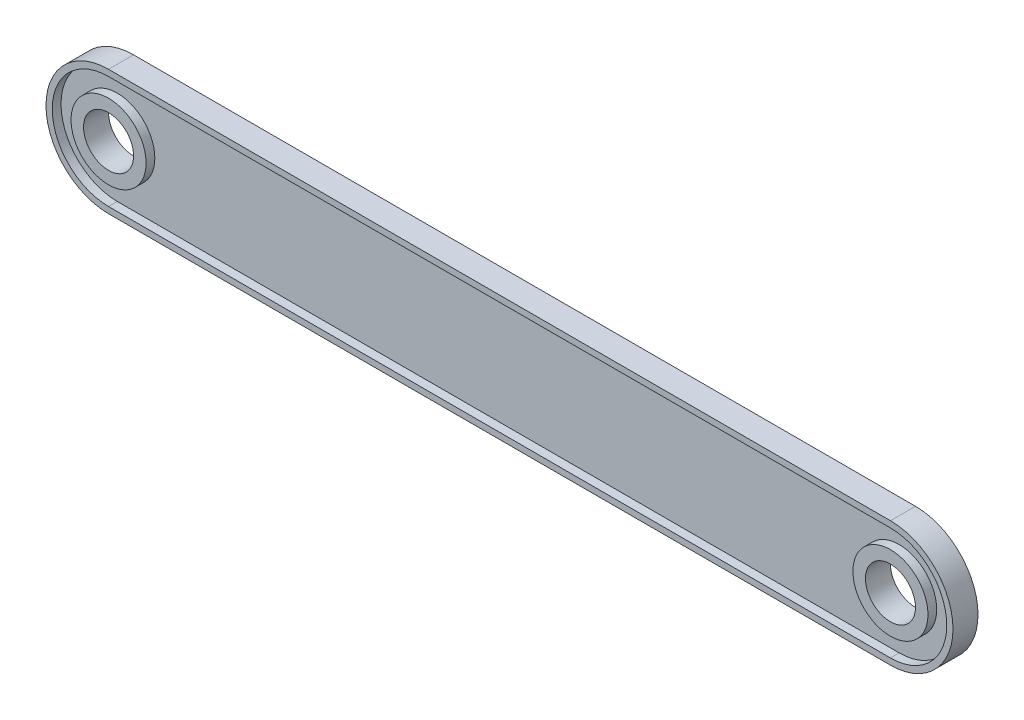
ISO-10303-21;
HEADER;
FILE_DESCRIPTION(('STEP AP214'),'2;1');
FILE_NAME('part.step','',(''),(''),'','','');
FILE_SCHEMA(('AUTOMOTIVE_DESIGN { 1 0 10303 214 1 1 1 1 }'));
ENDSEC;
DATA;
#1=APPLICATION_CONTEXT('core data for automotive mechanical design processes');
#2=APPLICATION_PROTOCOL_DEFINITION('international standard','automotive_design',2000,#1);
#3=PRODUCT_CONTEXT('',#1,'mechanical');
#4=PRODUCT('Part','Part','',(#3));
#5=PRODUCT_RELATED_PRODUCT_CATEGORY('part','',(#4));
#6=PRODUCT_DEFINITION_FORMATION('','',#4);
#7=PRODUCT_DEFINITION_CONTEXT('part definition',#1,'design');
#8=PRODUCT_DEFINITION('design','',#6,#7);
#9=PRODUCT_DEFINITION_SHAPE('','',#8);
#10=(LENGTH_UNIT() NAMED_UNIT(*) SI_UNIT(.MILLI.,.METRE.));
#11=(NAMED_UNIT(*) PLANE_ANGLE_UNIT() SI_UNIT($,.RADIAN.));
#12=(NAMED_UNIT(*) SI_UNIT($,.STERADIAN.) SOLID_ANGLE_UNIT());
#13=UNCERTAINTY_MEASURE_WITH_UNIT(LENGTH_MEASURE(1.E-05),#10,'distance_accuracy_value','');
#14=(GEOMETRIC_REPRESENTATION_CONTEXT(3) GLOBAL_UNCERTAINTY_ASSIGNED_CONTEXT((#13)) GLOBAL_UNIT_ASSIGNED_CONTEXT((#10,
#11,#12)) REPRESENTATION_CONTEXT('',''));
#15=CARTESIAN_POINT('',(0.,0.,0.));
#16=DIRECTION('',(0.,0.,1.));
#17=DIRECTION('',(1.,0.,0.));
#18=AXIS2_PLACEMENT_3D('',#15,#16,#17);
#19=CARTESIAN_POINT('',(0.,0.,3.));
#20=DIRECTION('',(0.,0.,1.));
#21=DIRECTION('',(1.,0.,0.));
#22=AXIS2_PLACEMENT_3D('',#19,#20,#21);
#23=PLANE('',#22);
#24=CARTESIAN_POINT('',(625.,0.,3.));
#25=DIRECTION('',(0.,0.,1.));
#26=DIRECTION('',(1.,0.,0.));
#27=AXIS2_PLACEMENT_3D('',#24,#25,#26);
#28=CIRCLE('',#27,30.);
#29=CARTESIAN_POINT('',(655.,0.,3.));
#30=VERTEX_POINT('',#29);
#31=EDGE_CURVE('E151',#30,#30,#28,.T.);
#32=ORIENTED_EDGE('',*,*,#31,.F.);
#33=EDGE_LOOP('',(#32));
#34=FACE_BOUND('',#33,.T.);
#35=CARTESIAN_POINT('',(0.,0.,3.));
#36=DIRECTION('',(0.,0.,1.));
#37=DIRECTION('',(1.,0.,0.));
#38=AXIS2_PLACEMENT_3D('',#35,#36,#37);
#39=CIRCLE('',#38,30.);
#40=CARTESIAN_POINT('',(30.,0.,3.));
#41=VERTEX_POINT('',#40);
#42=EDGE_CURVE('E154',#41,#41,#39,.T.);
#43=ORIENTED_EDGE('',*,*,#42,.F.);
#44=EDGE_LOOP('',(#43));
#45=FACE_BOUND('',#44,.T.);
#46=DIRECTION('',(1.,0.,0.));
#47=VECTOR('',#46,1.);
#48=CARTESIAN_POINT('',(0.,45.,3.));
#49=LINE('',#48,#47);
#50=CARTESIAN_POINT('',(0.,45.,3.));
#51=VERTEX_POINT('',#50);
#52=CARTESIAN_POINT('',(625.,45.,3.));
#53=VERTEX_POINT('',#52);
#54=EDGE_CURVE('E157',#51,#53,#49,.T.);
#55=ORIENTED_EDGE('',*,*,#54,.F.);
#56=CARTESIAN_POINT('',(0.,0.,3.));
#57=DIRECTION('',(0.,0.,1.));
#58=DIRECTION('',(1.,0.,0.));
#59=AXIS2_PLACEMENT_3D('',#56,#57,#58);
#60=CIRCLE('',#59,45.);
#61=CARTESIAN_POINT('',(0.,-45.,3.));
#62=VERTEX_POINT('',#61);
#63=EDGE_CURVE('E160',#51,#62,#60,.T.);
#64=ORIENTED_EDGE('',*,*,#63,.T.);
#65=DIRECTION('',(1.,0.,0.));
#66=VECTOR('',#65,1.);
#67=CARTESIAN_POINT('',(0.,-45.,3.));
#68=LINE('',#67,#66);
#69=CARTESIAN_POINT('',(625.,-45.,3.));
#70=VERTEX_POINT('',#69);
#71=EDGE_CURVE('E82',#62,#70,#68,.T.);
#72=ORIENTED_EDGE('',*,*,#71,.T.);
#73=CARTESIAN_POINT('',(625.,0.,3.));
#74=DIRECTION('',(0.,0.,1.));
#75=DIRECTION('',(1.,0.,0.));
#76=AXIS2_PLACEMENT_3D('',#73,#74,#75);
#77=CIRCLE('',#76,45.);
#78=EDGE_CURVE('E12',#70,#53,#77,.T.);
#79=ORIENTED_EDGE('',*,*,#78,.T.);
#80=EDGE_LOOP('',(#55,#64,#72,#79));
#81=FACE_BOUND('',#80,.T.);
#82=ADVANCED_FACE('F72',(#34,#45,#81),#23,.T.);
#83=CARTESIAN_POINT('',(0.,0.,-3.));
#84=DIRECTION('',(0.,0.,1.));
#85=DIRECTION('',(1.,0.,0.));
#86=AXIS2_PLACEMENT_3D('',#83,#84,#85);
#87=PLANE('',#86);
#88=CARTESIAN_POINT('',(625.,0.,-3.));
#89=DIRECTION('',(0.,0.,1.));
#90=DIRECTION('',(1.,0.,0.));
#91=AXIS2_PLACEMENT_3D('',#88,#89,#90);
#92=CIRCLE('',#91,30.);
#93=CARTESIAN_POINT('',(655.,0.,-3.));
#94=VERTEX_POINT('',#93);
#95=EDGE_CURVE('E233',#94,#94,#92,.F.);
#96=ORIENTED_EDGE('',*,*,#95,.F.);
#97=EDGE_LOOP('',(#96));
#98=FACE_BOUND('',#97,.T.);
#99=CARTESIAN_POINT('',(0.,0.,-3.));
#100=DIRECTION('',(0.,0.,1.));
#101=DIRECTION('',(1.,0.,0.));
#102=AXIS2_PLACEMENT_3D('',#99,#100,#101);
#103=CIRCLE('',#102,30.);
#104=CARTESIAN_POINT('',(30.,0.,-3.));
#105=VERTEX_POINT('',#104);
#106=EDGE_CURVE('E204',#105,#105,#103,.F.);
#107=ORIENTED_EDGE('',*,*,#106,.F.);
#108=EDGE_LOOP('',(#107));
#109=FACE_BOUND('',#108,.T.);
#110=DIRECTION('',(1.,0.,0.));
#111=VECTOR('',#110,1.);
#112=CARTESIAN_POINT('',(0.,45.,-3.));
#113=LINE('',#112,#111);
#114=CARTESIAN_POINT('',(0.,45.,-3.));
#115=VERTEX_POINT('',#114);
#116=CARTESIAN_POINT('',(625.,45.,-3.));
#117=VERTEX_POINT('',#116);
#118=EDGE_CURVE('E124',#115,#117,#113,.T.);
#119=ORIENTED_EDGE('',*,*,#118,.T.);
#120=CARTESIAN_POINT('',(625.,0.,-3.));
#121=DIRECTION('',(0.,0.,1.));
#122=DIRECTION('',(1.,0.,0.));
#123=AXIS2_PLACEMENT_3D('',#120,#121,#122);
#124=CIRCLE('',#123,45.);
#125=CARTESIAN_POINT('',(625.,-45.,-3.));
#126=VERTEX_POINT('',#125);
#127=EDGE_CURVE('E76',#126,#117,#124,.T.);
#128=ORIENTED_EDGE('',*,*,#127,.F.);
#129=DIRECTION('',(1.,0.,0.));
#130=VECTOR('',#129,1.);
#131=CARTESIAN_POINT('',(0.,-45.,-3.));
#132=LINE('',#131,#130);
#133=CARTESIAN_POINT('',(0.,-45.,-3.));
#134=VERTEX_POINT('',#133);
#135=EDGE_CURVE('E104',#134,#126,#132,.T.);
#136=ORIENTED_EDGE('',*,*,#135,.F.);
#137=CARTESIAN_POINT('',(0.,0.,-3.));
#138=DIRECTION('',(0.,0.,1.));
#139=DIRECTION('',(1.,0.,0.));
#140=AXIS2_PLACEMENT_3D('',#137,#138,#139);
#141=CIRCLE('',#140,45.);
#142=EDGE_CURVE('E106',#115,#134,#141,.T.);
#143=ORIENTED_EDGE('',*,*,#142,.F.);
#144=EDGE_LOOP('',(#119,#128,#136,#143));
#145=FACE_BOUND('',#144,.T.);
#146=ADVANCED_FACE('F74',(#98,#109,#145),#87,.F.);
#147=CARTESIAN_POINT('',(0.,0.,10.));
#148=DIRECTION('',(0.,0.,-1.));
#149=DIRECTION('',(-1.,0.,0.));
#150=AXIS2_PLACEMENT_3D('',#147,#148,#149);
#151=CYLINDRICAL_SURFACE('',#150,45.);
#152=ORIENTED_EDGE('',*,*,#142,.T.);
#153=DIRECTION('',(0.,0.,-1.));
#154=VECTOR('',#153,1.);
#155=CARTESIAN_POINT('',(0.,-45.,10.));
#156=LINE('',#155,#154);
#157=CARTESIAN_POINT('',(0.,-45.,-10.));
#158=VERTEX_POINT('',#157);
#159=EDGE_CURVE('E120',#134,#158,#156,.T.);
#160=ORIENTED_EDGE('',*,*,#159,.T.);
#161=CARTESIAN_POINT('',(0.,0.,-10.));
#162=DIRECTION('',(0.,0.,1.));
#163=DIRECTION('',(1.,0.,0.));
#164=AXIS2_PLACEMENT_3D('',#161,#162,#163);
#165=CIRCLE('',#164,45.);
#166=CARTESIAN_POINT('',(0.,45.,-10.));
#167=VERTEX_POINT('',#166);
#168=EDGE_CURVE('E203',#167,#158,#165,.T.);
#169=ORIENTED_EDGE('',*,*,#168,.F.);
#170=DIRECTION('',(0.,0.,-1.));
#171=VECTOR('',#170,1.);
#172=CARTESIAN_POINT('',(0.,45.,10.));
#173=LINE('',#172,#171);
#174=EDGE_CURVE('E123',#115,#167,#173,.T.);
#175=ORIENTED_EDGE('',*,*,#174,.F.);
#176=EDGE_LOOP('',(#152,#160,#169,#175));
#177=FACE_BOUND('',#176,.T.);
#178=ADVANCED_FACE('F117',(#177),#151,.F.);
#179=CARTESIAN_POINT('',(0.,45.,10.));
#180=DIRECTION('',(0.,1.,0.));
#181=DIRECTION('',(0.,0.,1.));
#182=AXIS2_PLACEMENT_3D('',#179,#180,#181);
#183=PLANE('',#182);
#184=DIRECTION('',(0.,0.,-1.));
#185=VECTOR('',#184,1.);
#186=CARTESIAN_POINT('',(625.,45.,10.));
#187=LINE('',#186,#185);
#188=CARTESIAN_POINT('',(625.,45.,-10.));
#189=VERTEX_POINT('',#188);
#190=EDGE_CURVE('E143',#117,#189,#187,.T.);
#191=ORIENTED_EDGE('',*,*,#190,.F.);
#192=ORIENTED_EDGE('',*,*,#118,.F.);
#193=ORIENTED_EDGE('',*,*,#174,.T.);
#194=DIRECTION('',(1.,0.,0.));
#195=VECTOR('',#194,1.);
#196=CARTESIAN_POINT('',(0.,45.,-10.));
#197=LINE('',#196,#195);
#198=EDGE_CURVE('E200',#167,#189,#197,.T.);
#199=ORIENTED_EDGE('',*,*,#198,.T.);
#200=EDGE_LOOP('',(#191,#192,#193,#199));
#201=FACE_BOUND('',#200,.T.);
#202=ADVANCED_FACE('F295',(#201),#183,.F.);
#203=CARTESIAN_POINT('',(625.,0.,10.));
#204=DIRECTION('',(0.,0.,-1.));
#205=DIRECTION('',(-1.,0.,0.));
#206=AXIS2_PLACEMENT_3D('',#203,#204,#205);
#207=CYLINDRICAL_SURFACE('',#206,45.);
#208=ORIENTED_EDGE('',*,*,#127,.T.);
#209=ORIENTED_EDGE('',*,*,#190,.T.);
#210=CARTESIAN_POINT('',(625.,0.,-10.));
#211=DIRECTION('',(0.,0.,1.));
#212=DIRECTION('',(1.,0.,0.));
#213=AXIS2_PLACEMENT_3D('',#210,#211,#212);
#214=CIRCLE('',#213,45.);
#215=CARTESIAN_POINT('',(625.,-45.,-10.));
#216=VERTEX_POINT('',#215);
#217=EDGE_CURVE('E197',#216,#189,#214,.T.);
#218=ORIENTED_EDGE('',*,*,#217,.F.);
#219=DIRECTION('',(0.,0.,-1.));
#220=VECTOR('',#219,1.);
#221=CARTESIAN_POINT('',(625.,-45.,10.));
#222=LINE('',#221,#220);
#223=EDGE_CURVE('E134',#126,#216,#222,.T.);
#224=ORIENTED_EDGE('',*,*,#223,.F.);
#225=EDGE_LOOP('',(#208,#209,#218,#224));
#226=FACE_BOUND('',#225,.T.);
#227=ADVANCED_FACE('F300',(#226),#207,.F.);
#228=CARTESIAN_POINT('',(0.,-45.,10.));
#229=DIRECTION('',(0.,1.,0.));
#230=DIRECTION('',(0.,0.,1.));
#231=AXIS2_PLACEMENT_3D('',#228,#229,#230);
#232=PLANE('',#231);
#233=ORIENTED_EDGE('',*,*,#135,.T.);
#234=ORIENTED_EDGE('',*,*,#223,.T.);
#235=DIRECTION('',(1.,0.,0.));
#236=VECTOR('',#235,1.);
#237=CARTESIAN_POINT('',(0.,-45.,-10.));
#238=LINE('',#237,#236);
#239=EDGE_CURVE('E129',#158,#216,#238,.T.);
#240=ORIENTED_EDGE('',*,*,#239,.F.);
#241=ORIENTED_EDGE('',*,*,#159,.F.);
#242=EDGE_LOOP('',(#233,#234,#240,#241));
#243=FACE_BOUND('',#242,.T.);
#244=ADVANCED_FACE('F127',(#243),#232,.T.);
#245=CARTESIAN_POINT('',(0.,-50.,10.));
#246=DIRECTION('',(0.,1.,0.));
#247=DIRECTION('',(0.,0.,1.));
#248=AXIS2_PLACEMENT_3D('',#245,#246,#247);
#249=PLANE('',#248);
#250=DIRECTION('',(1.,0.,0.));
#251=VECTOR('',#250,1.);
#252=CARTESIAN_POINT('',(0.,-50.,-10.));
#253=LINE('',#252,#251);
#254=CARTESIAN_POINT('',(0.,-50.,-10.));
#255=VERTEX_POINT('',#254);
#256=CARTESIAN_POINT('',(625.,-50.,-10.));
#257=VERTEX_POINT('',#256);
#258=EDGE_CURVE('E194',#255,#257,#253,.T.);
#259=ORIENTED_EDGE('',*,*,#258,.T.);
#260=DIRECTION('',(0.,0.,-1.));
#261=VECTOR('',#260,1.);
#262=CARTESIAN_POINT('',(625.,-50.,10.));
#263=LINE('',#262,#261);
#264=CARTESIAN_POINT('',(625.,-50.,10.));
#265=VERTEX_POINT('',#264);
#266=EDGE_CURVE('E140',#265,#257,#263,.T.);
#267=ORIENTED_EDGE('',*,*,#266,.F.);
#268=DIRECTION('',(1.,0.,0.));
#269=VECTOR('',#268,1.);
#270=CARTESIAN_POINT('',(0.,-50.,10.));
#271=LINE('',#270,#269);
#272=CARTESIAN_POINT('',(0.,-50.,10.));
#273=VERTEX_POINT('',#272);
#274=EDGE_CURVE('E210',#273,#265,#271,.T.);
#275=ORIENTED_EDGE('',*,*,#274,.F.);
#276=DIRECTION('',(0.,0.,-1.));
#277=VECTOR('',#276,1.);
#278=CARTESIAN_POINT('',(0.,-50.,10.));
#279=LINE('',#278,#277);
#280=EDGE_CURVE('E150',#273,#255,#279,.T.);
#281=ORIENTED_EDGE('',*,*,#280,.T.);
#282=EDGE_LOOP('',(#259,#267,#275,#281));
#283=FACE_BOUND('',#282,.T.);
#284=ADVANCED_FACE('F304',(#283),#249,.F.);
#285=CARTESIAN_POINT('',(625.,0.,10.));
#286=DIRECTION('',(0.,0.,-1.));
#287=DIRECTION('',(-1.,0.,0.));
#288=AXIS2_PLACEMENT_3D('',#285,#286,#287);
#289=CYLINDRICAL_SURFACE('',#288,50.);
#290=CARTESIAN_POINT('',(625.,0.,-10.));
#291=DIRECTION('',(0.,0.,1.));
#292=DIRECTION('',(1.,0.,0.));
#293=AXIS2_PLACEMENT_3D('',#290,#291,#292);
#294=CIRCLE('',#293,50.);
#295=CARTESIAN_POINT('',(625.,50.,-10.));
#296=VERTEX_POINT('',#295);
#297=EDGE_CURVE('E192',#257,#296,#294,.T.);
#298=ORIENTED_EDGE('',*,*,#297,.T.);
#299=DIRECTION('',(0.,0.,-1.));
#300=VECTOR('',#299,1.);
#301=CARTESIAN_POINT('',(625.,50.,10.));
#302=LINE('',#301,#300);
#303=CARTESIAN_POINT('',(625.,50.,10.));
#304=VERTEX_POINT('',#303);
#305=EDGE_CURVE('E166',#304,#296,#302,.T.);
#306=ORIENTED_EDGE('',*,*,#305,.F.);
#307=CARTESIAN_POINT('',(625.,0.,10.));
#308=DIRECTION('',(0.,0.,1.));
#309=DIRECTION('',(1.,0.,0.));
#310=AXIS2_PLACEMENT_3D('',#307,#308,#309);
#311=CIRCLE('',#310,50.);
#312=EDGE_CURVE('E207',#265,#304,#311,.T.);
#313=ORIENTED_EDGE('',*,*,#312,.F.);
#314=ORIENTED_EDGE('',*,*,#266,.T.);
#315=EDGE_LOOP('',(#298,#306,#313,#314));
#316=FACE_BOUND('',#315,.T.);
#317=ADVANCED_FACE('F307',(#316),#289,.T.);
#318=CARTESIAN_POINT('',(0.,50.,10.));
#319=DIRECTION('',(0.,1.,0.));
#320=DIRECTION('',(0.,0.,1.));
#321=AXIS2_PLACEMENT_3D('',#318,#319,#320);
#322=PLANE('',#321);
#323=DIRECTION('',(1.,0.,0.));
#324=VECTOR('',#323,1.);
#325=CARTESIAN_POINT('',(0.,50.,-10.));
#326=LINE('',#325,#324);
#327=CARTESIAN_POINT('',(0.,50.,-10.));
#328=VERTEX_POINT('',#327);
#329=EDGE_CURVE('E189',#328,#296,#326,.T.);
#330=ORIENTED_EDGE('',*,*,#329,.F.);
#331=DIRECTION('',(0.,0.,-1.));
#332=VECTOR('',#331,1.);
#333=CARTESIAN_POINT('',(0.,50.,10.));
#334=LINE('',#333,#332);
#335=CARTESIAN_POINT('',(0.,50.,10.));
#336=VERTEX_POINT('',#335);
#337=EDGE_CURVE('E174',#336,#328,#334,.T.);
#338=ORIENTED_EDGE('',*,*,#337,.F.);
#339=DIRECTION('',(1.,0.,0.));
#340=VECTOR('',#339,1.);
#341=CARTESIAN_POINT('',(0.,50.,10.));
#342=LINE('',#341,#340);
#343=EDGE_CURVE('E136',#336,#304,#342,.T.);
#344=ORIENTED_EDGE('',*,*,#343,.T.);
#345=ORIENTED_EDGE('',*,*,#305,.T.);
#346=EDGE_LOOP('',(#330,#338,#344,#345));
#347=FACE_BOUND('',#346,.T.);
#348=ADVANCED_FACE('F289',(#347),#322,.T.);
#349=CARTESIAN_POINT('',(0.,-45.,10.));
#350=VERTEX_POINT('',#349);
#351=EDGE_CURVE('E130',#350,#62,#156,.T.);
#352=ORIENTED_EDGE('',*,*,#351,.T.);
#353=ORIENTED_EDGE('',*,*,#63,.F.);
#354=CARTESIAN_POINT('',(0.,45.,10.));
#355=VERTEX_POINT('',#354);
#356=EDGE_CURVE('E147',#355,#51,#173,.T.);
#357=ORIENTED_EDGE('',*,*,#356,.F.);
#358=CARTESIAN_POINT('',(0.,0.,10.));
#359=DIRECTION('',(0.,0.,1.));
#360=DIRECTION('',(1.,0.,0.));
#361=AXIS2_PLACEMENT_3D('',#358,#359,#360);
#362=CIRCLE('',#361,45.);
#363=EDGE_CURVE('E188',#355,#350,#362,.T.);
#364=ORIENTED_EDGE('',*,*,#363,.T.);
#365=EDGE_LOOP('',(#352,#353,#357,#364));
#366=FACE_BOUND('',#365,.T.);
#367=ADVANCED_FACE('F285',(#366),#151,.F.);
#368=ORIENTED_EDGE('',*,*,#54,.T.);
#369=CARTESIAN_POINT('',(625.,45.,10.));
#370=VERTEX_POINT('',#369);
#371=EDGE_CURVE('E144',#370,#53,#187,.T.);
#372=ORIENTED_EDGE('',*,*,#371,.F.);
#373=DIRECTION('',(1.,0.,0.));
#374=VECTOR('',#373,1.);
#375=CARTESIAN_POINT('',(0.,45.,10.));
#376=LINE('',#375,#374);
#377=EDGE_CURVE('E218',#355,#370,#376,.T.);
#378=ORIENTED_EDGE('',*,*,#377,.F.);
#379=ORIENTED_EDGE('',*,*,#356,.T.);
#380=EDGE_LOOP('',(#368,#372,#378,#379));
#381=FACE_BOUND('',#380,.T.);
#382=ADVANCED_FACE('F288',(#381),#183,.F.);
#383=ORIENTED_EDGE('',*,*,#371,.T.);
#384=ORIENTED_EDGE('',*,*,#78,.F.);
#385=CARTESIAN_POINT('',(625.,-45.,10.));
#386=VERTEX_POINT('',#385);
#387=EDGE_CURVE('E90',#386,#70,#222,.T.);
#388=ORIENTED_EDGE('',*,*,#387,.F.);
#389=CARTESIAN_POINT('',(625.,0.,10.));
#390=DIRECTION('',(0.,0.,1.));
#391=DIRECTION('',(1.,0.,0.));
#392=AXIS2_PLACEMENT_3D('',#389,#390,#391);
#393=CIRCLE('',#392,45.);
#394=EDGE_CURVE('E215',#386,#370,#393,.T.);
#395=ORIENTED_EDGE('',*,*,#394,.T.);
#396=EDGE_LOOP('',(#383,#384,#388,#395));
#397=FACE_BOUND('',#396,.T.);
#398=ADVANCED_FACE('F293',(#397),#207,.F.);
#399=ORIENTED_EDGE('',*,*,#387,.T.);
#400=ORIENTED_EDGE('',*,*,#71,.F.);
#401=ORIENTED_EDGE('',*,*,#351,.F.);
#402=DIRECTION('',(1.,0.,0.));
#403=VECTOR('',#402,1.);
#404=CARTESIAN_POINT('',(0.,-45.,10.));
#405=LINE('',#404,#403);
#406=EDGE_CURVE('E213',#350,#386,#405,.T.);
#407=ORIENTED_EDGE('',*,*,#406,.T.);
#408=EDGE_LOOP('',(#399,#400,#401,#407));
#409=FACE_BOUND('',#408,.T.);
#410=ADVANCED_FACE('F298',(#409),#232,.T.);
#411=CARTESIAN_POINT('',(0.,0.,10.));
#412=DIRECTION('',(0.,0.,-1.));
#413=DIRECTION('',(-1.,0.,0.));
#414=AXIS2_PLACEMENT_3D('',#411,#412,#413);
#415=CYLINDRICAL_SURFACE('',#414,50.);
#416=CARTESIAN_POINT('',(0.,0.,-10.));
#417=DIRECTION('',(0.,0.,1.));
#418=DIRECTION('',(1.,0.,0.));
#419=AXIS2_PLACEMENT_3D('',#416,#417,#418);
#420=CIRCLE('',#419,50.);
#421=EDGE_CURVE('E185',#328,#255,#420,.T.);
#422=ORIENTED_EDGE('',*,*,#421,.T.);
#423=ORIENTED_EDGE('',*,*,#280,.F.);
#424=CARTESIAN_POINT('',(0.,0.,10.));
#425=DIRECTION('',(0.,0.,1.));
#426=DIRECTION('',(1.,0.,0.));
#427=AXIS2_PLACEMENT_3D('',#424,#425,#426);
#428=CIRCLE('',#427,50.);
#429=EDGE_CURVE('E131',#336,#273,#428,.T.);
#430=ORIENTED_EDGE('',*,*,#429,.F.);
#431=ORIENTED_EDGE('',*,*,#337,.T.);
#432=EDGE_LOOP('',(#422,#423,#430,#431));
#433=FACE_BOUND('',#432,.T.);
#434=ADVANCED_FACE('F303',(#433),#415,.T.);
#435=CARTESIAN_POINT('',(0.,0.,10.));
#436=DIRECTION('',(0.,0.,1.));
#437=DIRECTION('',(1.,0.,0.));
#438=AXIS2_PLACEMENT_3D('',#435,#436,#437);
#439=PLANE('',#438);
#440=ORIENTED_EDGE('',*,*,#363,.F.);
#441=ORIENTED_EDGE('',*,*,#377,.T.);
#442=ORIENTED_EDGE('',*,*,#394,.F.);
#443=ORIENTED_EDGE('',*,*,#406,.F.);
#444=EDGE_LOOP('',(#440,#441,#442,#443));
#445=FACE_BOUND('',#444,.T.);
#446=ORIENTED_EDGE('',*,*,#274,.T.);
#447=ORIENTED_EDGE('',*,*,#312,.T.);
#448=ORIENTED_EDGE('',*,*,#343,.F.);
#449=ORIENTED_EDGE('',*,*,#429,.T.);
#450=EDGE_LOOP('',(#446,#447,#448,#449));
#451=FACE_BOUND('',#450,.T.);
#452=ADVANCED_FACE('F315',(#445,#451),#439,.T.);
#453=CARTESIAN_POINT('',(0.,0.,-10.));
#454=DIRECTION('',(0.,0.,1.));
#455=DIRECTION('',(1.,0.,0.));
#456=AXIS2_PLACEMENT_3D('',#453,#454,#455);
#457=PLANE('',#456);
#458=ORIENTED_EDGE('',*,*,#168,.T.);
#459=ORIENTED_EDGE('',*,*,#239,.T.);
#460=ORIENTED_EDGE('',*,*,#217,.T.);
#461=ORIENTED_EDGE('',*,*,#198,.F.);
#462=EDGE_LOOP('',(#458,#459,#460,#461));
#463=FACE_BOUND('',#462,.T.);
#464=ORIENTED_EDGE('',*,*,#258,.F.);
#465=ORIENTED_EDGE('',*,*,#421,.F.);
#466=ORIENTED_EDGE('',*,*,#329,.T.);
#467=ORIENTED_EDGE('',*,*,#297,.F.);
#468=EDGE_LOOP('',(#464,#465,#466,#467));
#469=FACE_BOUND('',#468,.T.);
#470=ADVANCED_FACE('F317',(#463,#469),#457,.F.);
#471=CARTESIAN_POINT('',(0.,0.,10.));
#472=DIRECTION('',(0.,0.,-1.));
#473=DIRECTION('',(-1.,0.,0.));
#474=AXIS2_PLACEMENT_3D('',#471,#472,#473);
#475=CYLINDRICAL_SURFACE('',#474,30.);
#476=CARTESIAN_POINT('',(0.,0.,-10.));
#477=DIRECTION('',(0.,0.,1.));
#478=DIRECTION('',(1.,0.,0.));
#479=AXIS2_PLACEMENT_3D('',#476,#477,#478);
#480=CIRCLE('',#479,30.);
#481=CARTESIAN_POINT('',(30.,0.,-10.));
#482=VERTEX_POINT('',#481);
#483=EDGE_CURVE('E230',#482,#482,#480,.T.);
#484=ORIENTED_EDGE('',*,*,#483,.T.);
#485=EDGE_LOOP('',(#484));
#486=FACE_BOUND('',#485,.T.);
#487=ORIENTED_EDGE('',*,*,#106,.T.);
#488=EDGE_LOOP('',(#487));
#489=FACE_BOUND('',#488,.T.);
#490=ADVANCED_FACE('F320',(#486,#489),#475,.T.);
#491=ORIENTED_EDGE('',*,*,#42,.T.);
#492=EDGE_LOOP('',(#491));
#493=FACE_BOUND('',#492,.T.);
#494=CARTESIAN_POINT('',(0.,0.,10.));
#495=DIRECTION('',(0.,0.,1.));
#496=DIRECTION('',(1.,0.,0.));
#497=AXIS2_PLACEMENT_3D('',#494,#495,#496);
#498=CIRCLE('',#497,30.);
#499=CARTESIAN_POINT('',(30.,0.,10.));
#500=VERTEX_POINT('',#499);
#501=EDGE_CURVE('E229',#500,#500,#498,.T.);
#502=ORIENTED_EDGE('',*,*,#501,.F.);
#503=EDGE_LOOP('',(#502));
#504=FACE_BOUND('',#503,.T.);
#505=ADVANCED_FACE('F325',(#493,#504),#475,.T.);
#506=CARTESIAN_POINT('',(0.,0.,10.));
#507=DIRECTION('',(0.,0.,-1.));
#508=DIRECTION('',(-1.,0.,0.));
#509=AXIS2_PLACEMENT_3D('',#506,#507,#508);
#510=CYLINDRICAL_SURFACE('',#509,20.);
#511=CARTESIAN_POINT('',(0.,0.,10.));
#512=DIRECTION('',(0.,0.,1.));
#513=DIRECTION('',(1.,0.,0.));
#514=AXIS2_PLACEMENT_3D('',#511,#512,#513);
#515=CIRCLE('',#514,20.);
#516=CARTESIAN_POINT('',(20.,0.,10.));
#517=VERTEX_POINT('',#516);
#518=EDGE_CURVE('E225',#517,#517,#515,.T.);
#519=ORIENTED_EDGE('',*,*,#518,.T.);
#520=EDGE_LOOP('',(#519));
#521=FACE_BOUND('',#520,.T.);
#522=CARTESIAN_POINT('',(0.,0.,-10.));
#523=DIRECTION('',(0.,0.,1.));
#524=DIRECTION('',(1.,0.,0.));
#525=AXIS2_PLACEMENT_3D('',#522,#523,#524);
#526=CIRCLE('',#525,20.);
#527=CARTESIAN_POINT('',(20.,0.,-10.));
#528=VERTEX_POINT('',#527);
#529=EDGE_CURVE('E226',#528,#528,#526,.T.);
#530=ORIENTED_EDGE('',*,*,#529,.F.);
#531=EDGE_LOOP('',(#530));
#532=FACE_BOUND('',#531,.T.);
#533=ADVANCED_FACE('F328',(#521,#532),#510,.F.);
#534=CARTESIAN_POINT('',(0.,0.,10.));
#535=DIRECTION('',(0.,0.,1.));
#536=DIRECTION('',(1.,0.,0.));
#537=AXIS2_PLACEMENT_3D('',#534,#535,#536);
#538=PLANE('',#537);
#539=ORIENTED_EDGE('',*,*,#501,.T.);
#540=EDGE_LOOP('',(#539));
#541=FACE_BOUND('',#540,.T.);
#542=ORIENTED_EDGE('',*,*,#518,.F.);
#543=EDGE_LOOP('',(#542));
#544=FACE_BOUND('',#543,.T.);
#545=ADVANCED_FACE('F332',(#541,#544),#538,.T.);
#546=CARTESIAN_POINT('',(0.,0.,-10.));
#547=DIRECTION('',(0.,0.,1.));
#548=DIRECTION('',(1.,0.,0.));
#549=AXIS2_PLACEMENT_3D('',#546,#547,#548);
#550=PLANE('',#549);
#551=ORIENTED_EDGE('',*,*,#483,.F.);
#552=EDGE_LOOP('',(#551));
#553=FACE_BOUND('',#552,.T.);
#554=ORIENTED_EDGE('',*,*,#529,.T.);
#555=EDGE_LOOP('',(#554));
#556=FACE_BOUND('',#555,.T.);
#557=ADVANCED_FACE('F274',(#553,#556),#550,.F.);
#558=CARTESIAN_POINT('',(625.,0.,10.));
#559=DIRECTION('',(0.,0.,-1.));
#560=DIRECTION('',(-1.,0.,0.));
#561=AXIS2_PLACEMENT_3D('',#558,#559,#560);
#562=CYLINDRICAL_SURFACE('',#561,30.);
#563=CARTESIAN_POINT('',(625.,0.,-10.));
#564=DIRECTION('',(0.,0.,1.));
#565=DIRECTION('',(1.,0.,0.));
#566=AXIS2_PLACEMENT_3D('',#563,#564,#565);
#567=CIRCLE('',#566,30.);
#568=CARTESIAN_POINT('',(655.,0.,-10.));
#569=VERTEX_POINT('',#568);
#570=EDGE_CURVE('E241',#569,#569,#567,.T.);
#571=ORIENTED_EDGE('',*,*,#570,.T.);
#572=EDGE_LOOP('',(#571));
#573=FACE_BOUND('',#572,.T.);
#574=ORIENTED_EDGE('',*,*,#95,.T.);
#575=EDGE_LOOP('',(#574));
#576=FACE_BOUND('',#575,.T.);
#577=ADVANCED_FACE('F267',(#573,#576),#562,.T.);
#578=CARTESIAN_POINT('',(625.,0.,10.));
#579=DIRECTION('',(0.,0.,-1.));
#580=DIRECTION('',(-1.,0.,0.));
#581=AXIS2_PLACEMENT_3D('',#578,#579,#580);
#582=CYLINDRICAL_SURFACE('',#581,20.);
#583=CARTESIAN_POINT('',(625.,0.,10.));
#584=DIRECTION('',(0.,0.,1.));
#585=DIRECTION('',(1.,0.,0.));
#586=AXIS2_PLACEMENT_3D('',#583,#584,#585);
#587=CIRCLE('',#586,20.);
#588=CARTESIAN_POINT('',(645.,0.,10.));
#589=VERTEX_POINT('',#588);
#590=EDGE_CURVE('E244',#589,#589,#587,.T.);
#591=ORIENTED_EDGE('',*,*,#590,.T.);
#592=EDGE_LOOP('',(#591));
#593=FACE_BOUND('',#592,.T.);
#594=CARTESIAN_POINT('',(625.,0.,-10.));
#595=DIRECTION('',(0.,0.,1.));
#596=DIRECTION('',(1.,0.,0.));
#597=AXIS2_PLACEMENT_3D('',#594,#595,#596);
#598=CIRCLE('',#597,20.);
#599=CARTESIAN_POINT('',(645.,0.,-10.));
#600=VERTEX_POINT('',#599);
#601=EDGE_CURVE('E245',#600,#600,#598,.T.);
#602=ORIENTED_EDGE('',*,*,#601,.F.);
#603=EDGE_LOOP('',(#602));
#604=FACE_BOUND('',#603,.T.);
#605=ADVANCED_FACE('F253',(#593,#604),#582,.F.);
#606=ORIENTED_EDGE('',*,*,#31,.T.);
#607=EDGE_LOOP('',(#606));
#608=FACE_BOUND('',#607,.T.);
#609=CARTESIAN_POINT('',(625.,0.,10.));
#610=DIRECTION('',(0.,0.,1.));
#611=DIRECTION('',(1.,0.,0.));
#612=AXIS2_PLACEMENT_3D('',#609,#610,#611);
#613=CIRCLE('',#612,30.);
#614=CARTESIAN_POINT('',(655.,0.,10.));
#615=VERTEX_POINT('',#614);
#616=EDGE_CURVE('E240',#615,#615,#613,.T.);
#617=ORIENTED_EDGE('',*,*,#616,.F.);
#618=EDGE_LOOP('',(#617));
#619=FACE_BOUND('',#618,.T.);
#620=ADVANCED_FACE('F260',(#608,#619),#562,.T.);
#621=CARTESIAN_POINT('',(0.,0.,10.));
#622=DIRECTION('',(0.,0.,1.));
#623=DIRECTION('',(1.,0.,0.));
#624=AXIS2_PLACEMENT_3D('',#621,#622,#623);
#625=PLANE('',#624);
#626=ORIENTED_EDGE('',*,*,#590,.F.);
#627=EDGE_LOOP('',(#626));
#628=FACE_BOUND('',#627,.T.);
#629=ORIENTED_EDGE('',*,*,#616,.T.);
#630=EDGE_LOOP('',(#629));
#631=FACE_BOUND('',#630,.T.);
#632=ADVANCED_FACE('F256',(#628,#631),#625,.T.);
#633=CARTESIAN_POINT('',(0.,0.,-10.));
#634=DIRECTION('',(0.,0.,1.));
#635=DIRECTION('',(1.,0.,0.));
#636=AXIS2_PLACEMENT_3D('',#633,#634,#635);
#637=PLANE('',#636);
#638=ORIENTED_EDGE('',*,*,#601,.T.);
#639=EDGE_LOOP('',(#638));
#640=FACE_BOUND('',#639,.T.);
#641=ORIENTED_EDGE('',*,*,#570,.F.);
#642=EDGE_LOOP('',(#641));
#643=FACE_BOUND('',#642,.T.);
#644=ADVANCED_FACE('F259',(#640,#643),#637,.F.);
#645=CLOSED_SHELL('',(#82,#146,#178,#202,#227,#244,#284,#317,#348,#367,#382,#398,#410,#434,#452,
#470,#490,#505,#533,#545,#557,#577,#605,#620,#632,#644));
#646=MANIFOLD_SOLID_BREP('B2',#645);
#647=ADVANCED_BREP_SHAPE_REPRESENTATION('',(#18,#646),#14);
#648=SHAPE_DEFINITION_REPRESENTATION(#9,#647);
ENDSEC;
END-ISO-10303-21;
